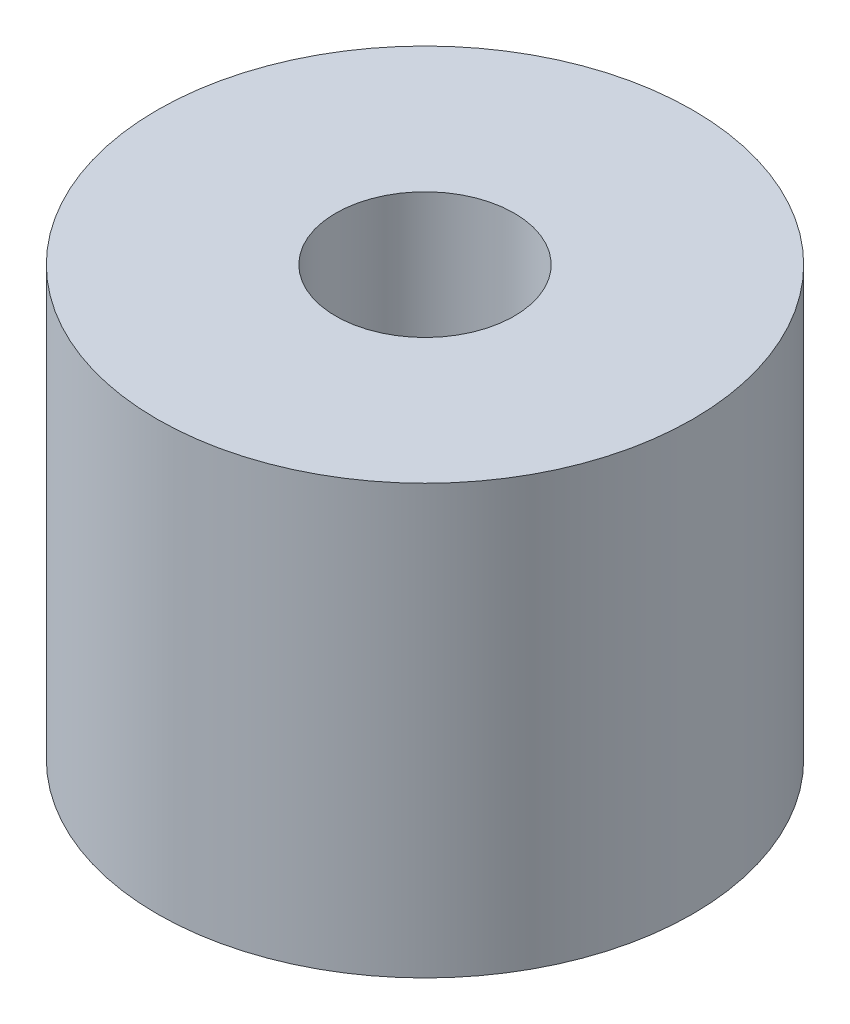
ISO-10303-21;
HEADER;
FILE_DESCRIPTION(('STEP AP214'),'2;1');
FILE_NAME('part.step','',(''),(''),'','','');
FILE_SCHEMA(('AUTOMOTIVE_DESIGN { 1 0 10303 214 1 1 1 1 }'));
ENDSEC;
DATA;
#1=APPLICATION_CONTEXT('core data for automotive mechanical design processes');
#2=APPLICATION_PROTOCOL_DEFINITION('international standard','automotive_design',2000,#1);
#3=PRODUCT_CONTEXT('',#1,'mechanical');
#4=PRODUCT('Part','Part','',(#3));
#5=PRODUCT_RELATED_PRODUCT_CATEGORY('part','',(#4));
#6=PRODUCT_DEFINITION_FORMATION('','',#4);
#7=PRODUCT_DEFINITION_CONTEXT('part definition',#1,'design');
#8=PRODUCT_DEFINITION('design','',#6,#7);
#9=PRODUCT_DEFINITION_SHAPE('','',#8);
#10=(LENGTH_UNIT() NAMED_UNIT(*) SI_UNIT(.MILLI.,.METRE.));
#11=(NAMED_UNIT(*) PLANE_ANGLE_UNIT() SI_UNIT($,.RADIAN.));
#12=(NAMED_UNIT(*) SI_UNIT($,.STERADIAN.) SOLID_ANGLE_UNIT());
#13=UNCERTAINTY_MEASURE_WITH_UNIT(LENGTH_MEASURE(1.E-05),#10,'distance_accuracy_value','');
#14=(GEOMETRIC_REPRESENTATION_CONTEXT(3) GLOBAL_UNCERTAINTY_ASSIGNED_CONTEXT((#13)) GLOBAL_UNIT_ASSIGNED_CONTEXT((#10,
#11,#12)) REPRESENTATION_CONTEXT('',''));
#15=CARTESIAN_POINT('',(0.,0.,0.));
#16=DIRECTION('',(0.,0.,1.));
#17=DIRECTION('',(1.,0.,0.));
#18=AXIS2_PLACEMENT_3D('',#15,#16,#17);
#19=CARTESIAN_POINT('',(0.,7.62,0.));
#20=DIRECTION('',(0.,1.,0.));
#21=DIRECTION('',(0.,0.,1.));
#22=AXIS2_PLACEMENT_3D('',#19,#20,#21);
#23=PLANE('',#22);
#24=CARTESIAN_POINT('',(0.,7.62,0.));
#25=DIRECTION('',(0.,1.,0.));
#26=DIRECTION('',(0.,0.,1.));
#27=AXIS2_PLACEMENT_3D('',#24,#25,#26);
#28=CIRCLE('',#27,4.7625);
#29=CARTESIAN_POINT('',(0.,7.62,-4.7625));
#30=VERTEX_POINT('',#29);
#31=EDGE_CURVE('E10',#30,#30,#28,.T.);
#32=ORIENTED_EDGE('',*,*,#31,.T.);
#33=EDGE_LOOP('',(#32));
#34=FACE_BOUND('',#33,.T.);
#35=CARTESIAN_POINT('',(0.,7.62,0.));
#36=DIRECTION('',(0.,1.,0.));
#37=DIRECTION('',(0.,0.,1.));
#38=AXIS2_PLACEMENT_3D('',#35,#36,#37);
#39=CIRCLE('',#38,1.5875);
#40=CARTESIAN_POINT('',(0.,7.62,-1.5875));
#41=VERTEX_POINT('',#40);
#42=EDGE_CURVE('E46',#41,#41,#39,.T.);
#43=ORIENTED_EDGE('',*,*,#42,.F.);
#44=EDGE_LOOP('',(#43));
#45=FACE_BOUND('',#44,.T.);
#46=ADVANCED_FACE('F35',(#34,#45),#23,.T.);
#47=CARTESIAN_POINT('',(0.,0.,0.));
#48=DIRECTION('',(0.,1.,0.));
#49=DIRECTION('',(0.,0.,1.));
#50=AXIS2_PLACEMENT_3D('',#47,#48,#49);
#51=PLANE('',#50);
#52=CARTESIAN_POINT('',(0.,0.,0.));
#53=DIRECTION('',(0.,1.,0.));
#54=DIRECTION('',(0.,0.,1.));
#55=AXIS2_PLACEMENT_3D('',#52,#53,#54);
#56=CIRCLE('',#55,4.7625);
#57=CARTESIAN_POINT('',(0.,0.,-4.7625));
#58=VERTEX_POINT('',#57);
#59=EDGE_CURVE('E39',#58,#58,#56,.T.);
#60=ORIENTED_EDGE('',*,*,#59,.F.);
#61=EDGE_LOOP('',(#60));
#62=FACE_BOUND('',#61,.T.);
#63=CARTESIAN_POINT('',(0.,0.,0.));
#64=DIRECTION('',(0.,1.,0.));
#65=DIRECTION('',(0.,0.,1.));
#66=AXIS2_PLACEMENT_3D('',#63,#64,#65);
#67=CIRCLE('',#66,1.5875);
#68=CARTESIAN_POINT('',(0.,0.,-1.5875));
#69=VERTEX_POINT('',#68);
#70=EDGE_CURVE('E48',#69,#69,#67,.T.);
#71=ORIENTED_EDGE('',*,*,#70,.T.);
#72=EDGE_LOOP('',(#71));
#73=FACE_BOUND('',#72,.T.);
#74=ADVANCED_FACE('F58',(#62,#73),#51,.F.);
#75=CARTESIAN_POINT('',(0.,7.62,0.));
#76=DIRECTION('',(0.,-1.,0.));
#77=DIRECTION('',(0.,0.,-1.));
#78=AXIS2_PLACEMENT_3D('',#75,#76,#77);
#79=CYLINDRICAL_SURFACE('',#78,4.7625);
#80=CARTESIAN_POINT('',(0.,7.62,-4.7625));
#81=CARTESIAN_POINT('',(0.,7.540625,-4.7625));
#82=CARTESIAN_POINT('',(0.,7.46125,-4.7625));
#83=CARTESIAN_POINT('',(0.,7.3025,-4.7625));
#84=CARTESIAN_POINT('',(0.,7.223125,-4.7625));
#85=CARTESIAN_POINT('',(0.,7.064375,-4.7625));
#86=CARTESIAN_POINT('',(0.,6.985,-4.7625));
#87=CARTESIAN_POINT('',(0.,6.82625,-4.7625));
#88=CARTESIAN_POINT('',(0.,6.746875,-4.7625));
#89=CARTESIAN_POINT('',(0.,6.588125,-4.7625));
#90=CARTESIAN_POINT('',(0.,6.50875,-4.7625));
#91=CARTESIAN_POINT('',(0.,6.35,-4.7625));
#92=CARTESIAN_POINT('',(0.,6.270625,-4.7625));
#93=CARTESIAN_POINT('',(0.,6.111875,-4.7625));
#94=CARTESIAN_POINT('',(0.,6.0325,-4.7625));
#95=CARTESIAN_POINT('',(0.,5.87375,-4.7625));
#96=CARTESIAN_POINT('',(0.,5.794375,-4.7625));
#97=CARTESIAN_POINT('',(0.,5.635625,-4.7625));
#98=CARTESIAN_POINT('',(0.,5.55625,-4.7625));
#99=CARTESIAN_POINT('',(0.,5.3975,-4.7625));
#100=CARTESIAN_POINT('',(0.,5.318125,-4.7625));
#101=CARTESIAN_POINT('',(0.,5.159375,-4.7625));
#102=CARTESIAN_POINT('',(0.,5.08,-4.7625));
#103=CARTESIAN_POINT('',(0.,4.92125,-4.7625));
#104=CARTESIAN_POINT('',(0.,4.841875,-4.7625));
#105=CARTESIAN_POINT('',(0.,4.683125,-4.7625));
#106=CARTESIAN_POINT('',(0.,4.60375,-4.7625));
#107=CARTESIAN_POINT('',(0.,4.445,-4.7625));
#108=CARTESIAN_POINT('',(0.,4.365625,-4.7625));
#109=CARTESIAN_POINT('',(0.,4.206875,-4.7625));
#110=CARTESIAN_POINT('',(0.,4.1275,-4.7625));
#111=CARTESIAN_POINT('',(0.,3.96875,-4.7625));
#112=CARTESIAN_POINT('',(0.,3.889375,-4.7625));
#113=CARTESIAN_POINT('',(0.,3.730625,-4.7625));
#114=CARTESIAN_POINT('',(0.,3.65125,-4.7625));
#115=CARTESIAN_POINT('',(0.,3.4925,-4.7625));
#116=CARTESIAN_POINT('',(0.,3.413125,-4.7625));
#117=CARTESIAN_POINT('',(0.,3.254375,-4.7625));
#118=CARTESIAN_POINT('',(0.,3.175,-4.7625));
#119=CARTESIAN_POINT('',(0.,3.01625,-4.7625));
#120=CARTESIAN_POINT('',(0.,2.936875,-4.7625));
#121=CARTESIAN_POINT('',(0.,2.778125,-4.7625));
#122=CARTESIAN_POINT('',(0.,2.69875,-4.7625));
#123=CARTESIAN_POINT('',(0.,2.54,-4.7625));
#124=CARTESIAN_POINT('',(0.,2.460625,-4.7625));
#125=CARTESIAN_POINT('',(0.,2.301875,-4.7625));
#126=CARTESIAN_POINT('',(0.,2.2225,-4.7625));
#127=CARTESIAN_POINT('',(0.,2.06375,-4.7625));
#128=CARTESIAN_POINT('',(0.,1.984375,-4.7625));
#129=CARTESIAN_POINT('',(0.,1.825625,-4.7625));
#130=CARTESIAN_POINT('',(0.,1.74625,-4.7625));
#131=CARTESIAN_POINT('',(0.,1.5875,-4.7625));
#132=CARTESIAN_POINT('',(0.,1.508125,-4.7625));
#133=CARTESIAN_POINT('',(0.,1.349375,-4.7625));
#134=CARTESIAN_POINT('',(0.,1.27,-4.7625));
#135=CARTESIAN_POINT('',(0.,1.11125,-4.7625));
#136=CARTESIAN_POINT('',(0.,1.031875,-4.7625));
#137=CARTESIAN_POINT('',(0.,0.873125,-4.7625));
#138=CARTESIAN_POINT('',(0.,0.79375,-4.7625));
#139=CARTESIAN_POINT('',(0.,0.635,-4.7625));
#140=CARTESIAN_POINT('',(0.,0.555625,-4.7625));
#141=CARTESIAN_POINT('',(0.,0.396875,-4.7625));
#142=CARTESIAN_POINT('',(0.,0.3175,-4.7625));
#143=CARTESIAN_POINT('',(0.,0.15875,-4.7625));
#144=CARTESIAN_POINT('',(0.,0.0793749999999999,-4.7625));
#145=CARTESIAN_POINT('',(0.,0.,-4.7625));
#146=B_SPLINE_CURVE_WITH_KNOTS('',3,(#80,#81,#82,#83,#84,#85,#86,#87,#88,#89,#90,#91,#92,#93,
#94,#95,#96,#97,#98,#99,#100,#101,#102,#103,#104,#105,#106,#107,#108,#109,#110,#111,#112,#113,
#114,#115,#116,#117,#118,#119,#120,#121,#122,#123,#124,#125,#126,#127,#128,#129,#130,#131,#132,
#133,#134,#135,#136,#137,#138,#139,#140,#141,#142,#143,#144,#145),.UNSPECIFIED.,.F.,.F.,(4,2,2,
2,2,2,2,2,2,2,2,2,2,2,2,2,2,2,2,2,2,2,2,2,2,2,2,2,2,2,2,2,4),(0.,0.238125,0.476249999999999,
0.714375,0.952499999999999,1.190625,1.42875,1.666875,1.905,2.143125,2.38125,2.619375,2.8575,
3.095625,3.33375,3.571875,3.81,4.048125,4.28625,4.524375,4.7625,5.000625,5.23875,5.476875,5.715,
5.953125,6.19125,6.429375,6.6675,6.905625,7.14375,7.381875,7.62),.UNSPECIFIED.);
#147=EDGE_CURVE('BSEAM37',#30,#58,#146,.T.);
#148=ORIENTED_EDGE('',*,*,#31,.F.);
#149=ORIENTED_EDGE('',*,*,#59,.T.);
#150=ORIENTED_EDGE('',*,*,#147,.T.);
#151=ORIENTED_EDGE('',*,*,#147,.F.);
#152=EDGE_LOOP('',(#148,#150,#149,#151));
#153=FACE_BOUND('',#152,.T.);
#154=ADVANCED_FACE('F37',(#153),#79,.T.);
#155=CARTESIAN_POINT('',(0.,7.62,0.));
#156=DIRECTION('',(0.,-1.,0.));
#157=DIRECTION('',(0.,0.,-1.));
#158=AXIS2_PLACEMENT_3D('',#155,#156,#157);
#159=CYLINDRICAL_SURFACE('',#158,1.5875);
#160=CARTESIAN_POINT('',(0.,7.62,-1.5875));
#161=CARTESIAN_POINT('',(0.,7.540625,-1.5875));
#162=CARTESIAN_POINT('',(0.,7.46125,-1.5875));
#163=CARTESIAN_POINT('',(0.,7.3025,-1.5875));
#164=CARTESIAN_POINT('',(0.,7.223125,-1.5875));
#165=CARTESIAN_POINT('',(0.,7.064375,-1.5875));
#166=CARTESIAN_POINT('',(0.,6.985,-1.5875));
#167=CARTESIAN_POINT('',(0.,6.82625,-1.5875));
#168=CARTESIAN_POINT('',(0.,6.746875,-1.5875));
#169=CARTESIAN_POINT('',(0.,6.588125,-1.5875));
#170=CARTESIAN_POINT('',(0.,6.50875,-1.5875));
#171=CARTESIAN_POINT('',(0.,6.35,-1.5875));
#172=CARTESIAN_POINT('',(0.,6.270625,-1.5875));
#173=CARTESIAN_POINT('',(0.,6.111875,-1.5875));
#174=CARTESIAN_POINT('',(0.,6.0325,-1.5875));
#175=CARTESIAN_POINT('',(0.,5.87375,-1.5875));
#176=CARTESIAN_POINT('',(0.,5.794375,-1.5875));
#177=CARTESIAN_POINT('',(0.,5.635625,-1.5875));
#178=CARTESIAN_POINT('',(0.,5.55625,-1.5875));
#179=CARTESIAN_POINT('',(0.,5.3975,-1.5875));
#180=CARTESIAN_POINT('',(0.,5.318125,-1.5875));
#181=CARTESIAN_POINT('',(0.,5.159375,-1.5875));
#182=CARTESIAN_POINT('',(0.,5.08,-1.5875));
#183=CARTESIAN_POINT('',(0.,4.92125,-1.5875));
#184=CARTESIAN_POINT('',(0.,4.841875,-1.5875));
#185=CARTESIAN_POINT('',(0.,4.683125,-1.5875));
#186=CARTESIAN_POINT('',(0.,4.60375,-1.5875));
#187=CARTESIAN_POINT('',(0.,4.445,-1.5875));
#188=CARTESIAN_POINT('',(0.,4.365625,-1.5875));
#189=CARTESIAN_POINT('',(0.,4.206875,-1.5875));
#190=CARTESIAN_POINT('',(0.,4.1275,-1.5875));
#191=CARTESIAN_POINT('',(0.,3.96875,-1.5875));
#192=CARTESIAN_POINT('',(0.,3.889375,-1.5875));
#193=CARTESIAN_POINT('',(0.,3.730625,-1.5875));
#194=CARTESIAN_POINT('',(0.,3.65125,-1.5875));
#195=CARTESIAN_POINT('',(0.,3.4925,-1.5875));
#196=CARTESIAN_POINT('',(0.,3.413125,-1.5875));
#197=CARTESIAN_POINT('',(0.,3.254375,-1.5875));
#198=CARTESIAN_POINT('',(0.,3.175,-1.5875));
#199=CARTESIAN_POINT('',(0.,3.01625,-1.5875));
#200=CARTESIAN_POINT('',(0.,2.936875,-1.5875));
#201=CARTESIAN_POINT('',(0.,2.778125,-1.5875));
#202=CARTESIAN_POINT('',(0.,2.69875,-1.5875));
#203=CARTESIAN_POINT('',(0.,2.54,-1.5875));
#204=CARTESIAN_POINT('',(0.,2.460625,-1.5875));
#205=CARTESIAN_POINT('',(0.,2.301875,-1.5875));
#206=CARTESIAN_POINT('',(0.,2.2225,-1.5875));
#207=CARTESIAN_POINT('',(0.,2.06375,-1.5875));
#208=CARTESIAN_POINT('',(0.,1.984375,-1.5875));
#209=CARTESIAN_POINT('',(0.,1.825625,-1.5875));
#210=CARTESIAN_POINT('',(0.,1.74625,-1.5875));
#211=CARTESIAN_POINT('',(0.,1.5875,-1.5875));
#212=CARTESIAN_POINT('',(0.,1.508125,-1.5875));
#213=CARTESIAN_POINT('',(0.,1.349375,-1.5875));
#214=CARTESIAN_POINT('',(0.,1.27,-1.5875));
#215=CARTESIAN_POINT('',(0.,1.11125,-1.5875));
#216=CARTESIAN_POINT('',(0.,1.031875,-1.5875));
#217=CARTESIAN_POINT('',(0.,0.873125,-1.5875));
#218=CARTESIAN_POINT('',(0.,0.79375,-1.5875));
#219=CARTESIAN_POINT('',(0.,0.635,-1.5875));
#220=CARTESIAN_POINT('',(0.,0.555625,-1.5875));
#221=CARTESIAN_POINT('',(0.,0.396875,-1.5875));
#222=CARTESIAN_POINT('',(0.,0.3175,-1.5875));
#223=CARTESIAN_POINT('',(0.,0.15875,-1.5875));
#224=CARTESIAN_POINT('',(0.,0.0793749999999999,-1.5875));
#225=CARTESIAN_POINT('',(0.,0.,-1.5875));
#226=B_SPLINE_CURVE_WITH_KNOTS('',3,(#160,#161,#162,#163,#164,#165,#166,#167,#168,#169,#170,
#171,#172,#173,#174,#175,#176,#177,#178,#179,#180,#181,#182,#183,#184,#185,#186,#187,#188,#189,
#190,#191,#192,#193,#194,#195,#196,#197,#198,#199,#200,#201,#202,#203,#204,#205,#206,#207,#208,
#209,#210,#211,#212,#213,#214,#215,#216,#217,#218,#219,#220,#221,#222,#223,#224,#225),
.UNSPECIFIED.,.F.,.F.,(4,2,2,2,2,2,2,2,2,2,2,2,2,2,2,2,2,2,2,2,2,2,2,2,2,2,2,2,2,2,2,2,4),(0.,
0.238125,0.476249999999999,0.714375,0.952499999999999,1.190625,1.42875,1.666875,1.905,2.143125,
2.38125,2.619375,2.8575,3.095625,3.33375,3.571875,3.81,4.048125,4.28625,4.524375,4.7625,
5.000625,5.23875,5.476875,5.715,5.953125,6.19125,6.429375,6.6675,6.905625,7.14375,7.381875,
7.62),.UNSPECIFIED.);
#227=EDGE_CURVE('BSEAM54',#41,#69,#226,.T.);
#228=ORIENTED_EDGE('',*,*,#42,.T.);
#229=ORIENTED_EDGE('',*,*,#70,.F.);
#230=ORIENTED_EDGE('',*,*,#227,.T.);
#231=ORIENTED_EDGE('',*,*,#227,.F.);
#232=EDGE_LOOP('',(#228,#230,#229,#231));
#233=FACE_BOUND('',#232,.T.);
#234=ADVANCED_FACE('F54',(#233),#159,.F.);
#235=CLOSED_SHELL('',(#46,#74,#154,#234));
#236=MANIFOLD_SOLID_BREP('B2',#235);
#237=ADVANCED_BREP_SHAPE_REPRESENTATION('',(#18,#236),#14);
#238=SHAPE_DEFINITION_REPRESENTATION(#9,#237);
ENDSEC;
END-ISO-10303-21;
